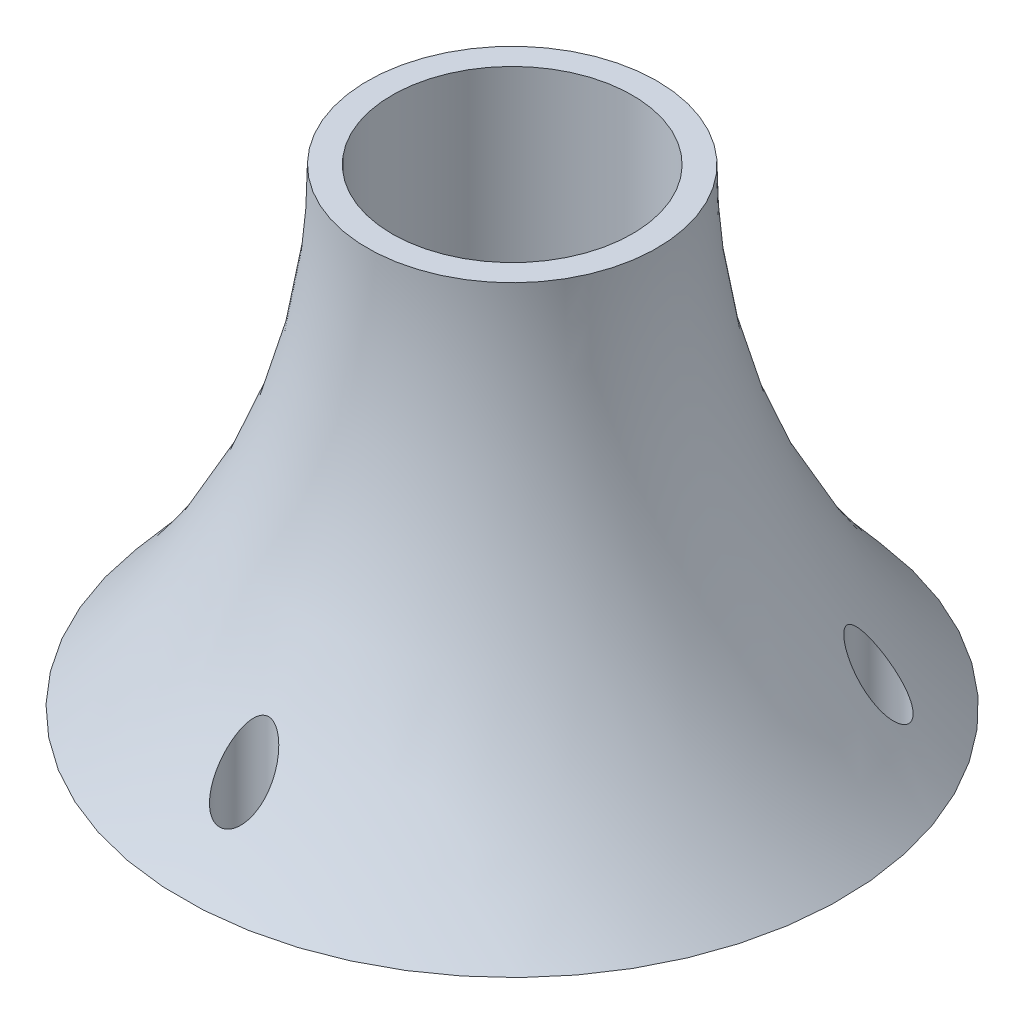
ISO-10303-21;
HEADER;
FILE_DESCRIPTION(('STEP AP214'),'2;1');
FILE_NAME('part.step','',(''),(''),'','','');
FILE_SCHEMA(('AUTOMOTIVE_DESIGN { 1 0 10303 214 1 1 1 1 }'));
ENDSEC;
DATA;
#1=APPLICATION_CONTEXT('core data for automotive mechanical design processes');
#2=APPLICATION_PROTOCOL_DEFINITION('international standard','automotive_design',2000,#1);
#3=PRODUCT_CONTEXT('',#1,'mechanical');
#4=PRODUCT('Part','Part','',(#3));
#5=PRODUCT_RELATED_PRODUCT_CATEGORY('part','',(#4));
#6=PRODUCT_DEFINITION_FORMATION('','',#4);
#7=PRODUCT_DEFINITION_CONTEXT('part definition',#1,'design');
#8=PRODUCT_DEFINITION('design','',#6,#7);
#9=PRODUCT_DEFINITION_SHAPE('','',#8);
#10=(LENGTH_UNIT() NAMED_UNIT(*) SI_UNIT(.MILLI.,.METRE.));
#11=(NAMED_UNIT(*) PLANE_ANGLE_UNIT() SI_UNIT($,.RADIAN.));
#12=(NAMED_UNIT(*) SI_UNIT($,.STERADIAN.) SOLID_ANGLE_UNIT());
#13=UNCERTAINTY_MEASURE_WITH_UNIT(LENGTH_MEASURE(1.E-05),#10,'distance_accuracy_value','');
#14=(GEOMETRIC_REPRESENTATION_CONTEXT(3) GLOBAL_UNCERTAINTY_ASSIGNED_CONTEXT((#13)) GLOBAL_UNIT_ASSIGNED_CONTEXT((#10,
#11,#12)) REPRESENTATION_CONTEXT('',''));
#15=CARTESIAN_POINT('',(0.,0.,0.));
#16=DIRECTION('',(0.,0.,1.));
#17=DIRECTION('',(1.,0.,0.));
#18=AXIS2_PLACEMENT_3D('',#15,#16,#17);
#19=CARTESIAN_POINT('',(0.,97.07,0.));
#20=DIRECTION('',(0.,1.,0.));
#21=DIRECTION('',(0.,0.,1.));
#22=AXIS2_PLACEMENT_3D('',#19,#20,#21);
#23=PLANE('',#22);
#24=CARTESIAN_POINT('',(0.,97.07,0.));
#25=DIRECTION('',(0.,-1.,0.));
#26=DIRECTION('',(0.,0.,-1.));
#27=AXIS2_PLACEMENT_3D('',#24,#25,#26);
#28=CIRCLE('',#27,29.845);
#29=CARTESIAN_POINT('',(0.,97.07,-29.845));
#30=VERTEX_POINT('',#29);
#31=EDGE_CURVE('E64',#30,#30,#28,.T.);
#32=ORIENTED_EDGE('',*,*,#31,.F.);
#33=EDGE_LOOP('',(#32));
#34=FACE_BOUND('',#33,.T.);
#35=CARTESIAN_POINT('',(0.,97.07,0.));
#36=DIRECTION('',(0.,1.,0.));
#37=DIRECTION('',(0.,0.,1.));
#38=AXIS2_PLACEMENT_3D('',#35,#36,#37);
#39=CIRCLE('',#38,24.765);
#40=CARTESIAN_POINT('',(0.,97.07,24.765));
#41=VERTEX_POINT('',#40);
#42=EDGE_CURVE('E10',#41,#41,#39,.T.);
#43=ORIENTED_EDGE('',*,*,#42,.F.);
#44=EDGE_LOOP('',(#43));
#45=FACE_BOUND('',#44,.T.);
#46=ADVANCED_FACE('F43',(#34,#45),#23,.T.);
#47=CARTESIAN_POINT('',(0.,0.,0.));
#48=DIRECTION('',(0.,1.,0.));
#49=DIRECTION('',(0.,0.,1.));
#50=AXIS2_PLACEMENT_3D('',#47,#48,#49);
#51=PLANE('',#50);
#52=CARTESIAN_POINT('',(-47.8435734320712,0.,-27.6225000000002));
#53=DIRECTION('',(0.,-1.,0.));
#54=DIRECTION('',(0.,0.,-1.));
#55=AXIS2_PLACEMENT_3D('',#52,#53,#54);
#56=CIRCLE('',#55,5.05);
#57=CARTESIAN_POINT('',(-47.8435734320712,0.,-32.6725000000002));
#58=VERTEX_POINT('',#57);
#59=EDGE_CURVE('E130',#58,#58,#56,.T.);
#60=ORIENTED_EDGE('',*,*,#59,.F.);
#61=EDGE_LOOP('',(#60));
#62=FACE_BOUND('',#61,.T.);
#63=CARTESIAN_POINT('',(47.8435734320716,0.,-27.6225));
#64=DIRECTION('',(0.,-1.,0.));
#65=DIRECTION('',(0.,0.,-1.));
#66=AXIS2_PLACEMENT_3D('',#63,#64,#65);
#67=CIRCLE('',#66,5.05);
#68=CARTESIAN_POINT('',(47.8435734320716,0.,-32.6725));
#69=VERTEX_POINT('',#68);
#70=EDGE_CURVE('E132',#69,#69,#67,.T.);
#71=ORIENTED_EDGE('',*,*,#70,.F.);
#72=EDGE_LOOP('',(#71));
#73=FACE_BOUND('',#72,.T.);
#74=CARTESIAN_POINT('',(0.,0.,55.245));
#75=DIRECTION('',(0.,-1.,0.));
#76=DIRECTION('',(0.,0.,-1.));
#77=AXIS2_PLACEMENT_3D('',#74,#75,#76);
#78=CIRCLE('',#77,5.05);
#79=CARTESIAN_POINT('',(0.,0.,50.195));
#80=VERTEX_POINT('',#79);
#81=EDGE_CURVE('E77',#80,#80,#78,.T.);
#82=ORIENTED_EDGE('',*,*,#81,.F.);
#83=EDGE_LOOP('',(#82));
#84=FACE_BOUND('',#83,.T.);
#85=CARTESIAN_POINT('',(0.,0.,0.));
#86=DIRECTION('',(0.,1.,0.));
#87=DIRECTION('',(0.,0.,1.));
#88=AXIS2_PLACEMENT_3D('',#85,#86,#87);
#89=CIRCLE('',#88,24.765);
#90=CARTESIAN_POINT('',(0.,0.,24.765));
#91=VERTEX_POINT('',#90);
#92=EDGE_CURVE('E60',#91,#91,#89,.T.);
#93=ORIENTED_EDGE('',*,*,#92,.T.);
#94=EDGE_LOOP('',(#93));
#95=FACE_BOUND('',#94,.T.);
#96=CARTESIAN_POINT('',(0.,0.,0.));
#97=DIRECTION('',(0.,-1.,0.));
#98=DIRECTION('',(0.,0.,-1.));
#99=AXIS2_PLACEMENT_3D('',#96,#97,#98);
#100=CIRCLE('',#99,67.945);
#101=CARTESIAN_POINT('',(0.,0.,-67.945));
#102=VERTEX_POINT('',#101);
#103=EDGE_CURVE('E118',#102,#102,#100,.T.);
#104=ORIENTED_EDGE('',*,*,#103,.T.);
#105=EDGE_LOOP('',(#104));
#106=FACE_BOUND('',#105,.T.);
#107=ADVANCED_FACE('F44',(#62,#73,#84,#95,#106),#51,.F.);
#108=CARTESIAN_POINT('',(0.,97.07,0.));
#109=DIRECTION('',(0.,-1.,0.));
#110=DIRECTION('',(0.,0.,-1.));
#111=AXIS2_PLACEMENT_3D('',#108,#109,#110);
#112=CYLINDRICAL_SURFACE('',#111,24.765);
#113=ORIENTED_EDGE('',*,*,#92,.F.);
#114=EDGE_LOOP('',(#113));
#115=FACE_BOUND('',#114,.T.);
#116=ORIENTED_EDGE('',*,*,#42,.T.);
#117=EDGE_LOOP('',(#116));
#118=FACE_BOUND('',#117,.T.);
#119=ADVANCED_FACE('F104',(#115,#118),#112,.F.);
#120=CARTESIAN_POINT('',(0.,97.07,0.));
#121=DIRECTION('',(0.,-1.,0.));
#122=DIRECTION('',(0.,0.,-1.));
#123=AXIS2_PLACEMENT_3D('',#120,#121,#122);
#124=TOROIDAL_SURFACE('',#123,172.550969816273,142.705969816273);
#125=CARTESIAN_POINT('',(-51.3571910642998,9.18542504719149,-31.2497566954239));
#126=CARTESIAN_POINT('',(-51.4889805939513,9.12629279793592,-31.1220855878612));
#127=CARTESIAN_POINT('',(-51.6163915120832,9.07750569736161,-30.9846758739162));
#128=CARTESIAN_POINT('',(-51.8577715013628,9.00385196658759,-30.6924605930095));
#129=CARTESIAN_POINT('',(-51.9717278741024,8.97900777784376,-30.5376388573802));
#130=CARTESIAN_POINT('',(-52.1821474068791,8.95510085105016,-30.2141306054535));
#131=CARTESIAN_POINT('',(-52.2785728679628,8.95609302703026,-30.0454153173187));
#132=CARTESIAN_POINT('',(-52.4505916390969,8.98392772963655,-29.6997976709833));
#133=CARTESIAN_POINT('',(-52.5261881469545,9.01076628529771,-29.5228965744017));
#134=CARTESIAN_POINT('',(-52.6532479192572,9.08694243283041,-29.1726810144053));
#135=CARTESIAN_POINT('',(-52.7054578396149,9.13546666011735,-28.9994552181204));
#136=CARTESIAN_POINT('',(-52.7901332466898,9.25189239951715,-28.6547815898227));
#137=CARTESIAN_POINT('',(-52.8225895021353,9.31980294949205,-28.4833346258229));
#138=CARTESIAN_POINT('',(-52.8798538927491,9.50614916560547,-28.0692248395133));
#139=CARTESIAN_POINT('',(-52.8946520887389,9.6335704273092,-27.8292236351956));
#140=CARTESIAN_POINT('',(-52.89236598386,9.91403714490475,-27.3647597340869));
#141=CARTESIAN_POINT('',(-52.8752081924902,10.067140927016,-27.1403340884313));
#142=CARTESIAN_POINT('',(-52.8230478405954,10.3491209532452,-26.76638161873));
#143=CARTESIAN_POINT('',(-52.7939439527388,10.4737397388432,-26.6127098448786));
#144=CARTESIAN_POINT('',(-52.7238197337986,10.7311798920443,-26.3151857335832));
#145=CARTESIAN_POINT('',(-52.6827938131023,10.8640050841455,-26.1713380412928));
#146=CARTESIAN_POINT('',(-52.5905582737983,11.1363537449466,-25.8933051450248));
#147=CARTESIAN_POINT('',(-52.5393362928549,11.2758851873965,-25.7591319426782));
#148=CARTESIAN_POINT('',(-52.4282233490621,11.5602398652776,-25.5004021278584));
#149=CARTESIAN_POINT('',(-52.3683326574624,11.7050629350244,-25.3758452146721));
#150=CARTESIAN_POINT('',(-52.2048841462658,12.0827408977526,-25.0677213845189));
#151=CARTESIAN_POINT('',(-52.0958756631025,12.3187800867426,-24.8909235716225));
#152=CARTESIAN_POINT('',(-51.863241685561,12.7986995078047,-24.5588625148154));
#153=CARTESIAN_POINT('',(-51.7396081427838,13.0425840030207,-24.4036112313807));
#154=CARTESIAN_POINT('',(-51.4802366030549,13.5365969863378,-24.1132045593151));
#155=CARTESIAN_POINT('',(-51.3444736468936,13.7867375496155,-23.9780922091115));
#156=CARTESIAN_POINT('',(-51.0631869510242,14.2911484127511,-23.7273656856467));
#157=CARTESIAN_POINT('',(-50.917664148072,14.5454183145021,-23.611749644851));
#158=CARTESIAN_POINT('',(-50.5610522273354,15.1549530487029,-23.3584271985312));
#159=CARTESIAN_POINT('',(-50.3462077864423,15.5115799541643,-23.2292342332674));
#160=CARTESIAN_POINT('',(-49.903764673542,16.2278333756835,-23.0051818458207));
#161=CARTESIAN_POINT('',(-49.67615938689,16.5874613636079,-22.9103404235291));
#162=CARTESIAN_POINT('',(-49.2103724417553,17.3068461815043,-22.7547881861978));
#163=CARTESIAN_POINT('',(-48.9722007276012,17.666602587011,-22.6940459851204));
#164=CARTESIAN_POINT('',(-48.607860103301,18.2043355301738,-22.6291505772046));
#165=CARTESIAN_POINT('',(-48.4852534998826,18.383233586753,-22.611889108989));
#166=CARTESIAN_POINT('',(-48.237713098497,18.7400501517795,-22.5863662701542));
#167=CARTESIAN_POINT('',(-48.1127795585337,18.9179687660236,-22.5781039077118));
#168=CARTESIAN_POINT('',(-47.8457004883016,19.2933455059943,-22.5705302974846));
#169=CARTESIAN_POINT('',(-47.7032675014544,19.490624673424,-22.5723938541501));
#170=CARTESIAN_POINT('',(-47.415565727374,19.8825513173929,-22.5886079499692));
#171=CARTESIAN_POINT('',(-47.2702974893187,20.077199291461,-22.6029560939145));
#172=CARTESIAN_POINT('',(-46.9769944186477,20.4626589169185,-22.6452035196624));
#173=CARTESIAN_POINT('',(-46.8289621843303,20.653473852619,-22.673090635542));
#174=CARTESIAN_POINT('',(-46.5299767824647,21.0299445764424,-22.7439162836606));
#175=CARTESIAN_POINT('',(-46.379024607341,21.2156020669655,-22.7868497840241));
#176=CARTESIAN_POINT('',(-46.1272467274621,21.5162452334686,-22.871952368916));
#177=CARTESIAN_POINT('',(-46.0272616621893,21.633336851442,-22.9091860699785));
#178=CARTESIAN_POINT('',(-45.8260861878564,21.8635540200579,-22.991725685609));
#179=CARTESIAN_POINT('',(-45.7248960928685,21.9766805750807,-23.0370295380013));
#180=CARTESIAN_POINT('',(-45.5214887079396,22.1977664911961,-23.1366071518463));
#181=CARTESIAN_POINT('',(-45.4192725831746,22.3057310537349,-23.190871627603));
#182=CARTESIAN_POINT('',(-45.2139924705968,22.515029028591,-23.3095141064333));
#183=CARTESIAN_POINT('',(-45.110928929641,22.6163657114392,-23.3738870673149));
#184=CARTESIAN_POINT('',(-44.8791435058713,22.8340688896325,-23.5311918886802));
#185=CARTESIAN_POINT('',(-44.7502859513275,22.9480848944491,-23.6272608794599));
#186=CARTESIAN_POINT('',(-44.4937313394135,23.1569239971862,-23.8398164163261));
#187=CARTESIAN_POINT('',(-44.3660328236439,23.2517758129311,-23.9562719166991));
#188=CARTESIAN_POINT('',(-44.1433829778103,23.3961956193831,-24.1829708382673));
#189=CARTESIAN_POINT('',(-44.0474849194469,23.4511456975404,-24.288797813388));
#190=CARTESIAN_POINT('',(-43.8614111314557,23.5402859830029,-24.5134687249089));
#191=CARTESIAN_POINT('',(-43.7712286609462,23.5745010687754,-24.6322968591308));
#192=CARTESIAN_POINT('',(-43.5993681756206,23.618759765635,-24.8816477245366));
#193=CARTESIAN_POINT('',(-43.5177576958334,23.6286234779872,-25.0122501488205));
#194=CARTESIAN_POINT('',(-43.3671330170521,23.6223856572957,-25.2799439143788));
#195=CARTESIAN_POINT('',(-43.2981200186529,23.6062816508517,-25.4170358725678));
#196=CARTESIAN_POINT('',(-43.1809484049022,23.5530965712203,-25.6780815014988));
#197=CARTESIAN_POINT('',(-43.1313607067592,23.5183965594448,-25.8019026605298));
#198=CARTESIAN_POINT('',(-43.0435685454763,23.4327171168868,-26.0478482878237));
#199=CARTESIAN_POINT('',(-43.0053687063103,23.3817310906217,-26.1699720477314));
#200=CARTESIAN_POINT('',(-42.9192961892907,23.231268802932,-26.4846919200454));
#201=CARTESIAN_POINT('',(-42.8798813149089,23.121239450053,-26.6745269822559));
#202=CARTESIAN_POINT('',(-42.8235202133011,22.8781053751534,-27.0424578759662));
#203=CARTESIAN_POINT('',(-42.8066455624142,22.7449286545555,-27.2205146123056));
#204=CARTESIAN_POINT('',(-42.7919488157082,22.4807392817009,-27.5432537966827));
#205=CARTESIAN_POINT('',(-42.7920222954795,22.3515088602384,-27.6893358591784));
#206=CARTESIAN_POINT('',(-42.8037528327141,22.0844803788837,-27.9730566904351));
#207=CARTESIAN_POINT('',(-42.8154188779009,21.9466757491099,-28.1106888200477));
#208=CARTESIAN_POINT('',(-42.8486347276977,21.6646477508644,-28.3783375229721));
#209=CARTESIAN_POINT('',(-42.8702004277398,21.520414397648,-28.5083414679898));
#210=CARTESIAN_POINT('',(-42.9219391848506,21.2272640066344,-28.7612156438113));
#211=CARTESIAN_POINT('',(-42.9521153185303,21.0783453116611,-28.8840833058152));
#212=CARTESIAN_POINT('',(-43.0175511797424,20.7883293764854,-29.1142171343939));
#213=CARTESIAN_POINT('',(-43.0522586894876,20.6474850204411,-29.2219619253091));
#214=CARTESIAN_POINT('',(-43.1276340050293,20.3634496910466,-29.4321608580421));
#215=CARTESIAN_POINT('',(-43.1683027601515,20.2202583471715,-29.5346141536708));
#216=CARTESIAN_POINT('',(-43.2985993830345,19.7878075391565,-29.8345911083435));
#217=CARTESIAN_POINT('',(-43.3964882541717,19.4957984802111,-30.0246322871578));
#218=CARTESIAN_POINT('',(-43.611858638314,18.9071827793383,-30.3864524007352));
#219=CARTESIAN_POINT('',(-43.7293703360095,18.6105697028961,-30.5582025223342));
#220=CARTESIAN_POINT('',(-43.9823232585734,18.0152881056454,-30.8837439158287));
#221=CARTESIAN_POINT('',(-44.1177592835521,17.7166202046783,-31.0375403718639));
#222=CARTESIAN_POINT('',(-44.4154622596525,17.0983763449959,-31.3370842356929));
#223=CARTESIAN_POINT('',(-44.5789295635586,16.7787646525674,-31.4815658622569));
#224=CARTESIAN_POINT('',(-44.9246389843112,16.140652802864,-31.7492565254035));
#225=CARTESIAN_POINT('',(-45.1068857295127,15.8221529397019,-31.8724602977581));
#226=CARTESIAN_POINT('',(-45.4893901488808,15.1887261114475,-32.095671752534));
#227=CARTESIAN_POINT('',(-45.689612641345,14.873793469445,-32.1957234308993));
#228=CARTESIAN_POINT('',(-46.1081055870343,14.248970908954,-32.370346512386));
#229=CARTESIAN_POINT('',(-46.3263671059593,13.9390785840617,-32.4449304362605));
#230=CARTESIAN_POINT('',(-46.6963369792063,13.440527640156,-32.5426765559738));
#231=CARTESIAN_POINT('',(-46.8426688174293,13.2495748450822,-32.5746493336586));
#232=CARTESIAN_POINT('',(-47.1422667464906,12.8714629737439,-32.6258755990967));
#233=CARTESIAN_POINT('',(-47.2955311332129,12.6843029813602,-32.6451321947026));
#234=CARTESIAN_POINT('',(-47.6087293517456,12.3148680800871,-32.6694799588987));
#235=CARTESIAN_POINT('',(-47.7686589509105,12.1325901881653,-32.6745799823725));
#236=CARTESIAN_POINT('',(-48.094926336478,11.774113425591,-32.6688787853252));
#237=CARTESIAN_POINT('',(-48.2612622944358,11.5979128472252,-32.658082069632));
#238=CARTESIAN_POINT('',(-48.5546259208816,11.2992389462781,-32.6237508488033));
#239=CARTESIAN_POINT('',(-48.6803109335192,11.1749653491059,-32.6043795552043));
#240=CARTESIAN_POINT('',(-48.9344727135323,10.93144284411,-32.5549644187549));
#241=CARTESIAN_POINT('',(-49.062949592756,10.8121941381588,-32.5249201475798));
#242=CARTESIAN_POINT('',(-49.3220923326888,10.579866808952,-32.4530836158934));
#243=CARTESIAN_POINT('',(-49.4527567428356,10.4667842933848,-32.4112988713258));
#244=CARTESIAN_POINT('',(-49.715536855848,10.2480802983032,-32.3148201245072));
#245=CARTESIAN_POINT('',(-49.8476525691767,10.1424588726205,-32.2601260291279));
#246=CARTESIAN_POINT('',(-50.1704611219257,9.89589047888767,-32.1093890671413));
#247=CARTESIAN_POINT('',(-50.3614688468114,9.75973004604672,-32.0057277467856));
#248=CARTESIAN_POINT('',(-50.6444085562274,9.57465017035324,-31.8261021819516));
#249=CARTESIAN_POINT('',(-50.7379972979203,9.51621914953609,-31.7623113673861));
#250=CARTESIAN_POINT('',(-50.9232745217958,9.40653729325769,-31.6263874880907));
#251=CARTESIAN_POINT('',(-51.0149643830808,9.35528107911748,-31.5542607473492));
#252=CARTESIAN_POINT('',(-51.1479033516346,9.28577242558287,-31.4417977887449));
#253=CARTESIAN_POINT('',(-51.1902889117438,9.26435364142035,-31.4047213557857));
#254=CARTESIAN_POINT('',(-51.2743231657403,9.2234266203648,-31.3286673423209));
#255=CARTESIAN_POINT('',(-51.3159712836978,9.20391982706715,-31.2896883581051));
#256=CARTESIAN_POINT('',(-51.3571910642998,9.18542504719149,-31.2497566954239));
#257=B_SPLINE_CURVE_WITH_KNOTS('',3,(#125,#126,#127,#128,#129,#130,#131,#132,#133,#134,#135,
#136,#137,#138,#139,#140,#141,#142,#143,#144,#145,#146,#147,#148,#149,#150,#151,#152,#153,#154,
#155,#156,#157,#158,#159,#160,#161,#162,#163,#164,#165,#166,#167,#168,#169,#170,#171,#172,#173,
#174,#175,#176,#177,#178,#179,#180,#181,#182,#183,#184,#185,#186,#187,#188,#189,#190,#191,#192,
#193,#194,#195,#196,#197,#198,#199,#200,#201,#202,#203,#204,#205,#206,#207,#208,#209,#210,#211,
#212,#213,#214,#215,#216,#217,#218,#219,#220,#221,#222,#223,#224,#225,#226,#227,#228,#229,#230,
#231,#232,#233,#234,#235,#236,#237,#238,#239,#240,#241,#242,#243,#244,#245,#246,#247,#248,#249,
#250,#251,#252,#253,#254,#255,#256),.UNSPECIFIED.,.T.,.F.,(4,2,2,2,2,2,2,2,2,2,2,2,2,2,2,2,2,2,
2,2,2,2,2,2,2,2,2,2,2,2,2,2,2,2,2,2,2,2,2,2,2,2,2,2,2,2,2,2,2,2,2,2,2,2,2,2,2,2,2,2,2,2,2,2,2,
4),(0.,0.578134970386196,1.15681129549281,1.73671767126707,2.31653496606911,2.8762246993172,
3.43617578603305,4.24804246784648,5.06177853874275,5.6609356191236,6.26037406715301,
6.86054378772689,7.46069473265269,8.40247024971834,9.34476647298877,10.2890484389443,
11.2332399015067,12.5392618503122,13.8459671558943,15.1514677468836,15.8040030914437,
16.45646651051,17.1861317111098,17.9156569539377,18.6445278659325,19.3731552580656,
19.8481707367086,20.3230650077266,20.7974702096037,21.2716395217442,21.8612935105248,
22.4500572311845,22.9073912166353,23.3641753869895,23.8243241409045,24.2845167261328,
24.696371657923,25.1083935939457,25.7733498547752,26.440412699628,27.0246981785132,
27.6094370080289,28.1951180283501,28.7810085821347,29.3228837563739,29.8648453179275,
30.9492592232241,32.035356852649,33.1211400904331,34.2810295364764,35.4412055341038,
36.5991584035652,37.7565411643843,38.4842195997804,39.2117201236751,39.9387654960258,
40.6656048774515,41.1986714634935,41.7317594448242,42.2645069317043,42.7972582619496,
43.5633200781927,43.9452776494278,44.3269473303114,44.507635081792,44.6884582223004),.UNSPECIFIED.);
#258=CARTESIAN_POINT('',(-51.3571910642998,9.18542504719149,-31.2497566954239));
#259=VERTEX_POINT('',#258);
#260=EDGE_CURVE('E50',#259,#259,#257,.T.);
#261=ORIENTED_EDGE('',*,*,#260,.F.);
#262=EDGE_LOOP('',(#261));
#263=FACE_BOUND('',#262,.T.);
#264=CARTESIAN_POINT('',(51.3571910643002,9.18542504719119,-31.2497566954237));
#265=CARTESIAN_POINT('',(51.2631658752089,9.22761670798013,-31.3408371457834));
#266=CARTESIAN_POINT('',(51.1668391820427,9.27509824652639,-31.4270464864924));
#267=CARTESIAN_POINT('',(50.9709711615564,9.37941099379876,-31.5896290540654));
#268=CARTESIAN_POINT('',(50.8714278224048,9.43624814860042,-31.6659959700626));
#269=CARTESIAN_POINT('',(50.5692932570567,9.61931163419143,-31.8809125297006));
#270=CARTESIAN_POINT('',(50.3636193567052,9.75789524382806,-32.0048805516714));
#271=CARTESIAN_POINT('',(50.0256042962449,10.0050970285909,-32.1792003079983));
#272=CARTESIAN_POINT('',(49.8932422433492,10.106801254901,-32.2400443614494));
#273=CARTESIAN_POINT('',(49.6294831974294,10.3183912210094,-32.3483135449923));
#274=CARTESIAN_POINT('',(49.4980864025744,10.4282785919447,-32.3957359906781));
#275=CARTESIAN_POINT('',(49.2371702698158,10.6547723186272,-32.4783359598528));
#276=CARTESIAN_POINT('',(49.1076522389079,10.7713830951213,-32.5135053172181));
#277=CARTESIAN_POINT('',(48.8512086629893,11.0100637490964,-32.5726996564461));
#278=CARTESIAN_POINT('',(48.7242827658047,11.1321328777068,-32.5967261619641));
#279=CARTESIAN_POINT('',(48.4050841959473,11.4485496181293,-32.6450131911603));
#280=CARTESIAN_POINT('',(48.2148681754625,11.6460559938343,-32.662275280683));
#281=CARTESIAN_POINT('',(47.8425191452201,12.0492521306178,-32.6759363989034));
#282=CARTESIAN_POINT('',(47.6603904558933,12.2549461570498,-32.6723244081719));
#283=CARTESIAN_POINT('',(47.3045072512051,12.6728586138744,-32.6468185435996));
#284=CARTESIAN_POINT('',(47.1307663182504,12.8850867713817,-32.6248960046486));
#285=CARTESIAN_POINT('',(46.7922655104061,13.3142566783374,-32.5648462315021));
#286=CARTESIAN_POINT('',(46.6275050442885,13.5311981161692,-32.5267200655279));
#287=CARTESIAN_POINT('',(46.2283162948817,14.0762184096151,-32.4136565144073));
#288=CARTESIAN_POINT('',(45.9994278080659,14.4065364330142,-32.3298364957764));
#289=CARTESIAN_POINT('',(45.562042102593,15.0724018401026,-32.1340999763048));
#290=CARTESIAN_POINT('',(45.3535558211759,15.4079519180684,-32.0221685188712));
#291=CARTESIAN_POINT('',(44.9569347159756,16.0825446989236,-31.772776916241));
#292=CARTESIAN_POINT('',(44.7688416552541,16.4215930677822,-31.6352658936407));
#293=CARTESIAN_POINT('',(44.414062935633,17.1003166534464,-31.3366243249469));
#294=CARTESIAN_POINT('',(44.2473700282683,17.4399916182644,-31.1755018161297));
#295=CARTESIAN_POINT('',(43.9602500685729,18.0657242390907,-30.8568366062248));
#296=CARTESIAN_POINT('',(43.8366504470422,18.3519924830116,-30.7025554368687));
#297=CARTESIAN_POINT('',(43.6064273749415,18.9220040451873,-30.3772818051965));
#298=CARTESIAN_POINT('',(43.4998087328533,19.2057466268556,-30.206284631474));
#299=CARTESIAN_POINT('',(43.3056253090142,19.7673530606597,-29.8475798668969));
#300=CARTESIAN_POINT('',(43.2179767319134,20.0452376602135,-29.6599511494736));
#301=CARTESIAN_POINT('',(43.1023347445437,20.4561867023712,-29.364424078828));
#302=CARTESIAN_POINT('',(43.0664343368759,20.5921499590087,-29.2636002472437));
#303=CARTESIAN_POINT('',(43.0003668189321,20.861612191209,-29.0569401041051));
#304=CARTESIAN_POINT('',(42.970199106468,20.9951114242723,-28.9511043204895));
#305=CARTESIAN_POINT('',(42.9016761815175,21.3297080108252,-28.6759276348296));
#306=CARTESIAN_POINT('',(42.8675804111915,21.5287439189768,-28.5029146686639));
#307=CARTESIAN_POINT('',(42.829739117898,21.8192832253961,-28.2326065280391));
#308=CARTESIAN_POINT('',(42.8193386069906,21.914887570255,-28.1406060610995));
#309=CARTESIAN_POINT('',(42.8035054933895,22.1027068067267,-27.952810037276));
#310=CARTESIAN_POINT('',(42.7980718876689,22.1949223790633,-27.8570152507032));
#311=CARTESIAN_POINT('',(42.7927468652048,22.3761560344034,-27.6603074412824));
#312=CARTESIAN_POINT('',(42.7929161673304,22.4651286179656,-27.559350191532));
#313=CARTESIAN_POINT('',(42.7997053991148,22.6376476177825,-27.3531456379772));
#314=CARTESIAN_POINT('',(42.8063269244331,22.7211926863404,-27.2478972791341));
#315=CARTESIAN_POINT('',(42.837203726932,22.9611790810205,-26.9259944420199));
#316=CARTESIAN_POINT('',(42.8724322906555,23.107789692583,-26.7023229076616));
#317=CARTESIAN_POINT('',(42.9577197664403,23.3038484443446,-26.3381579141435));
#318=CARTESIAN_POINT('',(42.9951266753524,23.3681176991173,-26.2026808896356));
#319=CARTESIAN_POINT('',(43.0839668891359,23.4776507507473,-25.9285895278526));
#320=CARTESIAN_POINT('',(43.1353850400303,23.5229349474975,-25.789978727618));
#321=CARTESIAN_POINT('',(43.2533335414436,23.5905557995165,-25.5117697724018));
#322=CARTESIAN_POINT('',(43.320001730066,23.6126721968049,-25.3721746213979));
#323=CARTESIAN_POINT('',(43.4668204047605,23.6304376005163,-25.0984961317095));
#324=CARTESIAN_POINT('',(43.5469641836128,23.6260997363488,-24.9644100920816));
#325=CARTESIAN_POINT('',(43.7081253130554,23.5934972218284,-24.7208526052595));
#326=CARTESIAN_POINT('',(43.7880786871685,23.5679145094056,-24.6102955051979));
#327=CARTESIAN_POINT('',(43.9534968727261,23.4987025654764,-24.3994902491616));
#328=CARTESIAN_POINT('',(44.0389651112276,23.4550620194782,-24.2992486057991));
#329=CARTESIAN_POINT('',(44.2537038462402,23.3290574304797,-24.0656860083596));
#330=CARTESIAN_POINT('',(44.384821974522,23.2381252775358,-23.938725372249));
#331=CARTESIAN_POINT('',(44.6492053315199,23.0336451831762,-23.7071956629774));
#332=CARTESIAN_POINT('',(44.7824754312897,22.9200363840645,-23.6026884503506));
#333=CARTESIAN_POINT('',(45.0280720781261,22.6959927672558,-23.4279201906942));
#334=CARTESIAN_POINT('',(45.1404685450308,22.5877551926905,-23.3548642723495));
#335=CARTESIAN_POINT('',(45.3643524726256,22.3629716164318,-23.221023959213));
#336=CARTESIAN_POINT('',(45.4758392168374,22.2464196604158,-23.1602484808561));
#337=CARTESIAN_POINT('',(45.6976686400853,22.006967537451,-23.0494284517595));
#338=CARTESIAN_POINT('',(45.8080091940831,21.8840574754172,-22.9994012925095));
#339=CARTESIAN_POINT('',(46.0272756180036,21.6334894778974,-22.9089419858974));
#340=CARTESIAN_POINT('',(46.1362009517094,21.5058298097517,-22.868513380591));
#341=CARTESIAN_POINT('',(46.3460411391408,21.2546785527158,-22.7984579644679));
#342=CARTESIAN_POINT('',(46.4470434266659,21.1313987930625,-22.7683273454942));
#343=CARTESIAN_POINT('',(46.6477403959751,20.8822828496435,-22.7150306891961));
#344=CARTESIAN_POINT('',(46.7474348520009,20.7564462338246,-22.6918658395612));
#345=CARTESIAN_POINT('',(47.0446873805555,20.3757627030314,-22.6319858435736));
#346=CARTESIAN_POINT('',(47.2403195475238,20.1178569682861,-22.6049159361474));
#347=CARTESIAN_POINT('',(47.6268782809228,19.5964360361698,-22.5734220764036));
#348=CARTESIAN_POINT('',(47.8177933818364,19.3329096129012,-22.569048755789));
#349=CARTESIAN_POINT('',(48.1944548815623,18.8027972466351,-22.581184823363));
#350=CARTESIAN_POINT('',(48.3802024293926,18.5362120026979,-22.5976895307244));
#351=CARTESIAN_POINT('',(48.8086156018807,17.9105630100876,-22.6593700149535));
#352=CARTESIAN_POINT('',(49.049197555968,17.5508269948531,-22.7123767907822));
#353=CARTESIAN_POINT('',(49.5200318105714,16.831035849989,-22.8525612030639));
#354=CARTESIAN_POINT('',(49.7502790878298,16.4709806500917,-22.9397552603127));
#355=CARTESIAN_POINT('',(50.1981792332605,15.7538402776288,-23.1482132962777));
#356=CARTESIAN_POINT('',(50.4158543368655,15.3967508815071,-23.2694147557656));
#357=CARTESIAN_POINT('',(50.8362771891286,14.6876513966739,-23.5470061395489));
#358=CARTESIAN_POINT('',(51.0390348793349,14.3356380532008,-23.7033723415337));
#359=CARTESIAN_POINT('',(51.347211313456,13.7809790512459,-23.9823085455185));
#360=CARTESIAN_POINT('',(51.4587607040033,13.5756480582065,-24.0928704661325));
#361=CARTESIAN_POINT('',(51.674002747791,13.1687639115177,-24.3277032850602));
#362=CARTESIAN_POINT('',(51.7776973843344,12.9672098139517,-24.4519707031809));
#363=CARTESIAN_POINT('',(51.9757086238905,12.5691072777811,-24.7147512974383));
#364=CARTESIAN_POINT('',(52.0700336099762,12.3725544837882,-24.8532515094882));
#365=CARTESIAN_POINT('',(52.2475569021498,11.9856824771668,-25.145278969115));
#366=CARTESIAN_POINT('',(52.3307587025216,11.7953613211593,-25.298801471155));
#367=CARTESIAN_POINT('',(52.4614888304914,11.4768725583947,-25.5747184292224));
#368=CARTESIAN_POINT('',(52.5123625320368,11.3466966282863,-25.6932165359095));
#369=CARTESIAN_POINT('',(52.6062961318684,11.0912233364965,-25.9383937572409));
#370=CARTESIAN_POINT('',(52.6493544778518,10.9659269478735,-26.0650744903761));
#371=CARTESIAN_POINT('',(52.7263612360813,10.7214692043096,-26.3265706973371));
#372=CARTESIAN_POINT('',(52.7603217619488,10.6022998639636,-26.461375058569));
#373=CARTESIAN_POINT('',(52.8177528908474,10.3712878791731,-26.7392307819654));
#374=CARTESIAN_POINT('',(52.8412249174128,10.2594442422193,-26.8822810219944));
#375=CARTESIAN_POINT('',(52.8829479910405,10.0019186103665,-27.2350725676556));
#376=CARTESIAN_POINT('',(52.8954072335738,9.86047571470349,-27.4487054892505));
#377=CARTESIAN_POINT('',(52.8913091918847,9.60112515841636,-27.8895414050597));
#378=CARTESIAN_POINT('',(52.8747935057987,9.48318402790265,-28.1167244936047));
#379=CARTESIAN_POINT('',(52.8140635227268,9.29820763730888,-28.5346710655976));
#380=CARTESIAN_POINT('',(52.7759134313999,9.22572554221679,-28.7238440763192));
#381=CARTESIAN_POINT('',(52.7006554025968,9.13509315573094,-29.0084759971116));
#382=CARTESIAN_POINT('',(52.6725544961827,9.10789288472433,-29.103522918332));
#383=CARTESIAN_POINT('',(52.6102401795102,9.05997634662196,-29.2932294658914));
#384=CARTESIAN_POINT('',(52.5760294033649,9.03925729586468,-29.3878892412199));
#385=CARTESIAN_POINT('',(52.5012508956084,9.0045790973894,-29.5767067831035));
#386=CARTESIAN_POINT('',(52.4606411944004,8.99066726273498,-29.6708566601472));
#387=CARTESIAN_POINT('',(52.3734294973621,8.9701107901462,-29.8571077916003));
#388=CARTESIAN_POINT('',(52.3268301885979,8.96346290607772,-29.9492099430612));
#389=CARTESIAN_POINT('',(52.2279637099011,8.95757265766183,-30.1305430057898));
#390=CARTESIAN_POINT('',(52.1756978729748,8.95832855535481,-30.2197745859599));
#391=CARTESIAN_POINT('',(52.0659875670589,8.96721755054227,-30.3945707884657));
#392=CARTESIAN_POINT('',(52.0085439824399,8.97534939035232,-30.4801360333497));
#393=CARTESIAN_POINT('',(51.8590804253072,9.0047138405077,-30.68874743523));
#394=CARTESIAN_POINT('',(51.7641486391926,9.0304672313879,-30.8091101935478));
#395=CARTESIAN_POINT('',(51.5661814554529,9.09705147030402,-31.0382946784699));
#396=CARTESIAN_POINT('',(51.4631475913963,9.13787947038546,-31.147118580045));
#397=CARTESIAN_POINT('',(51.3571910643002,9.18542504719119,-31.2497566954237));
#398=B_SPLINE_CURVE_WITH_KNOTS('',3,(#264,#265,#266,#267,#268,#269,#270,#271,#272,#273,#274,
#275,#276,#277,#278,#279,#280,#281,#282,#283,#284,#285,#286,#287,#288,#289,#290,#291,#292,#293,
#294,#295,#296,#297,#298,#299,#300,#301,#302,#303,#304,#305,#306,#307,#308,#309,#310,#311,#312,
#313,#314,#315,#316,#317,#318,#319,#320,#321,#322,#323,#324,#325,#326,#327,#328,#329,#330,#331,
#332,#333,#334,#335,#336,#337,#338,#339,#340,#341,#342,#343,#344,#345,#346,#347,#348,#349,#350,
#351,#352,#353,#354,#355,#356,#357,#358,#359,#360,#361,#362,#363,#364,#365,#366,#367,#368,#369,
#370,#371,#372,#373,#374,#375,#376,#377,#378,#379,#380,#381,#382,#383,#384,#385,#386,#387,#388,
#389,#390,#391,#392,#393,#394,#395,#396,#397),.UNSPECIFIED.,.T.,.F.,(4,2,2,2,2,2,2,2,2,2,2,2,2,
2,2,2,2,2,2,2,2,2,2,2,2,2,2,2,2,2,2,2,2,2,2,2,2,2,2,2,2,2,2,2,2,2,2,2,2,2,2,2,2,2,2,2,2,2,2,2,2,
2,2,2,2,2,4),(0.,0.412374131408385,0.825011371409781,1.65209028222927,2.1845111958975,
2.71703852197027,3.24992007731898,3.78272874581497,4.60570253671612,5.42911081523799,
6.25381055838922,7.07845594178765,8.30823550838768,9.5386707661781,10.7715800307292,
12.0040705874756,13.0469814903479,14.0901871898801,15.1286862399587,15.6476228885442,
16.1665049955113,16.9630967148121,17.362209840147,17.7612423499581,18.1646005880013,
18.5680586034039,19.3714430869615,19.8336414000417,20.2953417892696,20.7613928274429,
21.227212580506,21.6418389044388,22.0567254150059,22.6649985475569,23.2749266093396,
23.7910851976918,24.3076172162002,24.8249788260527,25.3425310568362,25.8289218451761,
26.315395517974,27.2887979686579,28.2643709617328,29.2397252713457,30.5461848679275,
31.8532727519461,33.1579732540657,34.4617962250049,35.2369034675002,36.011814340688,
36.7860255315642,37.5599929341308,38.1093463044738,38.6588086694543,39.2075357551414,
39.7561883431151,40.5231080590568,41.2889276401129,41.9046284014867,42.2126350355258,
42.520509199577,42.8304938549572,43.1403399268195,43.4501132673311,43.7598337977916,
44.2246239607272,44.6893263585697),.UNSPECIFIED.);
#399=CARTESIAN_POINT('',(51.3571910643002,9.18542504719119,-31.2497566954237));
#400=VERTEX_POINT('',#399);
#401=EDGE_CURVE('E73',#400,#400,#398,.T.);
#402=ORIENTED_EDGE('',*,*,#401,.F.);
#403=EDGE_LOOP('',(#402));
#404=FACE_BOUND('',#403,.T.);
#405=CARTESIAN_POINT('',(-2.23326848097639,9.57238427129096,59.7743500518151));
#406=CARTESIAN_POINT('',(-2.07030092846753,9.47676650281626,59.8547028908452));
#407=CARTESIAN_POINT('',(-1.89886720076207,9.38962335521069,59.9282969363957));
#408=CARTESIAN_POINT('',(-1.54035068834348,9.23639459322939,60.0581118734264));
#409=CARTESIAN_POINT('',(-1.35326611662445,9.17031138762215,60.1143307775715));
#410=CARTESIAN_POINT('',(-1.06301131798476,9.08990825041809,60.1828690309237));
#411=CARTESIAN_POINT('',(-0.964220874618586,9.06616794002286,60.2031346675775));
#412=CARTESIAN_POINT('',(-0.764258389679296,9.02551762998858,60.2378632447805));
#413=CARTESIAN_POINT('',(-0.663087416250595,9.00860462653225,60.2523287372064));
#414=CARTESIAN_POINT('',(-0.459164095207316,8.98195928981404,60.2751286870166));
#415=CARTESIAN_POINT('',(-0.356412424237556,8.97222396679175,60.2834656971284));
#416=CARTESIAN_POINT('',(-0.150159523703398,8.96013132073005,60.2938225837817));
#417=CARTESIAN_POINT('',(-0.0466583509293569,8.95777344443894,60.2958429340241));
#418=CARTESIAN_POINT('',(0.152101015148446,8.96038026983793,60.2936098363092));
#419=CARTESIAN_POINT('',(0.24737269363501,8.96478836169366,60.2898332763668));
#420=CARTESIAN_POINT('',(0.437089465562303,8.97983653413502,60.2769475366724));
#421=CARTESIAN_POINT('',(0.531534270881921,8.99047870560245,60.2678365677844));
#422=CARTESIAN_POINT('',(0.718878145208872,9.01780316679275,60.2444620106948));
#423=CARTESIAN_POINT('',(0.811777530519703,9.03448420421874,60.2301994907864));
#424=CARTESIAN_POINT('',(0.995476878935392,9.07359628532477,60.1967935912811));
#425=CARTESIAN_POINT('',(1.08627598995412,9.09602961961719,60.1776482673274));
#426=CARTESIAN_POINT('',(1.35427646888481,9.17132424558929,60.1134735937265));
#427=CARTESIAN_POINT('',(1.52767340228656,9.23226967527485,60.0616286205374));
#428=CARTESIAN_POINT('',(1.86118583719154,9.37240266477932,59.9428673284688));
#429=CARTESIAN_POINT('',(2.02129576123006,9.45159783310304,59.8759447238292));
#430=CARTESIAN_POINT('',(2.41017558099865,9.67213457058617,59.6904224591331));
#431=CARTESIAN_POINT('',(2.62913744710168,9.82389769041368,59.563470741864));
#432=CARTESIAN_POINT('',(2.93165439509594,10.0707061261324,59.358739576552));
#433=CARTESIAN_POINT('',(3.02831146727319,10.1563280244153,59.287982256345));
#434=CARTESIAN_POINT('',(3.21331606440882,10.3330615115454,59.1425520939745));
#435=CARTESIAN_POINT('',(3.30166531722443,10.4241719523917,59.0678800710436));
#436=CARTESIAN_POINT('',(3.51290994451263,10.658151468385,58.8769755429514));
#437=CARTESIAN_POINT('',(3.6307666647071,10.8039576674727,58.7587692522759));
#438=CARTESIAN_POINT('',(3.84973202904195,11.1038322202895,58.5174034021963));
#439=CARTESIAN_POINT('',(3.95083220776435,11.2579046984373,58.3942413779616));
#440=CARTESIAN_POINT('',(4.13765236042537,11.5727620972021,58.1444293378656));
#441=CARTESIAN_POINT('',(4.22335193181186,11.7335555793668,58.0177749477124));
#442=CARTESIAN_POINT('',(4.3803906729928,12.0603182324454,57.7623680741235));
#443=CARTESIAN_POINT('',(4.45173053394835,12.2262871538111,57.633615691991));
#444=CARTESIAN_POINT('',(4.61766368645941,12.6572579856761,57.301919484781));
#445=CARTESIAN_POINT('',(4.70266750924348,12.9253027588768,57.0981015577358));
#446=CARTESIAN_POINT('',(4.8436249472697,13.4687182718893,56.6901252890165));
#447=CARTESIAN_POINT('',(4.89956207887913,13.7440930756976,56.4859668199094));
#448=CARTESIAN_POINT('',(4.98502898628668,14.3003745249555,56.0788487243076));
#449=CARTESIAN_POINT('',(5.01451860298592,14.5812889232633,55.8758913842607));
#450=CARTESIAN_POINT('',(5.04890992587827,15.1465112411053,55.4728322308179));
#451=CARTESIAN_POINT('',(5.05381621638295,15.4308185180209,55.2727298919603));
#452=CARTESIAN_POINT('',(5.04009648708538,16.0155966005975,54.8665242314566));
#453=CARTESIAN_POINT('',(5.02029632677346,16.3161722356576,54.6606125945758));
#454=CARTESIAN_POINT('',(4.95606067290001,16.9181829807695,54.2538554259775));
#455=CARTESIAN_POINT('',(4.91162078547084,17.2196182345717,54.0530108045136));
#456=CARTESIAN_POINT('',(4.79841914638018,17.8213177952745,53.6575783567067));
#457=CARTESIAN_POINT('',(4.72969635805146,18.121583203462,53.462981048667));
#458=CARTESIAN_POINT('',(4.56739503801342,18.7196638648239,53.0806165931842));
#459=CARTESIAN_POINT('',(4.47382532130706,19.0174799483952,52.8928470502463));
#460=CARTESIAN_POINT('',(4.30140811101841,19.4947204035412,52.5959520711492));
#461=CARTESIAN_POINT('',(4.23075139363912,19.675602184555,52.484368674674));
#462=CARTESIAN_POINT('',(4.07885857052256,20.0349083222657,52.2645179975286));
#463=CARTESIAN_POINT('',(3.99762426432697,20.2133330912721,52.1562501566515));
#464=CARTESIAN_POINT('',(3.82372377338983,20.5669202135526,51.9434044005243));
#465=CARTESIAN_POINT('',(3.7310528728877,20.7420811865397,51.8388280304246));
#466=CARTESIAN_POINT('',(3.53320991892613,21.0878211360882,51.6340154161046));
#467=CARTESIAN_POINT('',(3.42804089998687,21.2584012126016,51.5337781263944));
#468=CARTESIAN_POINT('',(3.23328961822983,21.5490943715201,51.3642377809327));
#469=CARTESIAN_POINT('',(3.14690726261314,21.6706569017443,51.2937459460135));
#470=CARTESIAN_POINT('',(2.96577837009087,21.909409610819,51.1560379897665));
#471=CARTESIAN_POINT('',(2.87103035278871,22.0265990105547,51.0888224514952));
#472=CARTESIAN_POINT('',(2.67249941827744,22.2550274690332,50.9584719559148));
#473=CARTESIAN_POINT('',(2.56873544526117,22.366278247689,50.8953289060083));
#474=CARTESIAN_POINT('',(2.35107345057806,22.5811907406656,50.7739296032494));
#475=CARTESIAN_POINT('',(2.23718229431045,22.6848575107251,50.7156700910294));
#476=CARTESIAN_POINT('',(1.98244233714984,22.895149866787,50.5979977397302));
#477=CARTESIAN_POINT('',(1.84001754536874,23.0003759439254,50.5394383218886));
#478=CARTESIAN_POINT('',(1.53972700203744,23.1927324977403,50.4328241855178));
#479=CARTESIAN_POINT('',(1.38188026522395,23.2798848546366,50.38475676153));
#480=CARTESIAN_POINT('',(1.08170129545162,23.4153604817796,50.3102564147677));
#481=CARTESIAN_POINT('',(0.941883423161057,23.4678815985137,50.2814678216998));
#482=CARTESIAN_POINT('',(0.654243722101411,23.5519612275828,50.2354494900986));
#483=CARTESIAN_POINT('',(0.506431530549509,23.5835443973249,50.2182061551445));
#484=CARTESIAN_POINT('',(0.205589790919327,23.6225407775049,50.1969228234542));
#485=CARTESIAN_POINT('',(0.0525318330076894,23.6297899555893,50.192972432335));
#486=CARTESIAN_POINT('',(-0.252387108593274,23.6187293808563,50.1990050943115));
#487=CARTESIAN_POINT('',(-0.404247834128714,23.6004142595444,50.2089910740406));
#488=CARTESIAN_POINT('',(-0.687011598040013,23.5434261006774,50.240124781418));
#489=CARTESIAN_POINT('',(-0.818506220048183,23.5069342958797,50.2600771326038));
#490=CARTESIAN_POINT('',(-1.07414958604465,23.4179650829442,50.3088415746843));
#491=CARTESIAN_POINT('',(-1.19829561409807,23.3654818081015,50.3376569171339));
#492=CARTESIAN_POINT('',(-1.51543677846247,23.209766529488,50.4234133498771));
#493=CARTESIAN_POINT('',(-1.70136763306163,23.0956033953082,50.4865250109381));
#494=CARTESIAN_POINT('',(-2.05117045571298,22.8441040382569,50.6264573850862));
#495=CARTESIAN_POINT('',(-2.21496845463663,22.7066934061783,50.7033221653314));
#496=CARTESIAN_POINT('',(-2.50440001877845,22.4337933873916,50.8570638029838));
#497=CARTESIAN_POINT('',(-2.63225590938381,22.3000089689995,50.9328580418585));
#498=CARTESIAN_POINT('',(-2.87442585187165,22.0238288843452,51.0903564973714));
#499=CARTESIAN_POINT('',(-2.9887291979426,21.8814265427243,51.172065305237));
#500=CARTESIAN_POINT('',(-3.2054263230671,21.5902049817545,51.3403136590651));
#501=CARTESIAN_POINT('',(-3.30780137049037,21.4413761597371,51.4268604953165));
#502=CARTESIAN_POINT('',(-3.50174620393338,21.1390552161261,51.6039128799332));
#503=CARTESIAN_POINT('',(-3.59331214064385,20.9855614575912,51.6944198229276));
#504=CARTESIAN_POINT('',(-3.75963220386604,20.6875815461676,51.8713969245753));
#505=CARTESIAN_POINT('',(-3.83514598610192,20.5433625147047,51.9576071766543));
#506=CARTESIAN_POINT('',(-3.97844995248494,20.2526351011891,52.1325710675188));
#507=CARTESIAN_POINT('',(-4.04623892778697,20.1061263648915,52.2213251016652));
#508=CARTESIAN_POINT('',(-4.23881788905966,19.6638031857686,52.4911200314848));
#509=CARTESIAN_POINT('',(-4.35275005115807,19.3653195581881,52.6756179761574));
#510=CARTESIAN_POINT('',(-4.55430104637823,18.7638965813395,53.0526133703268));
#511=CARTESIAN_POINT('',(-4.64187300474588,18.4609502877884,53.2451243853205));
#512=CARTESIAN_POINT('',(-4.79167096409019,17.8532413147335,53.6367946565301));
#513=CARTESIAN_POINT('',(-4.85390432869187,17.5484791890868,53.8359519630439));
#514=CARTESIAN_POINT('',(-4.95656412564076,16.9192120612876,54.2530302177462));
#515=CARTESIAN_POINT('',(-4.99533944058855,16.5946921869911,54.471336162723));
#516=CARTESIAN_POINT('',(-5.04401832150635,15.9471396225473,54.9135413436791));
#517=CARTESIAN_POINT('',(-5.05391386061656,15.6241073707741,55.1374421172513));
#518=CARTESIAN_POINT('',(-5.04332094765622,14.9824213908765,55.5888830589889));
#519=CARTESIAN_POINT('',(-5.022918141712,14.6637578806601,55.8164111767295));
#520=CARTESIAN_POINT('',(-4.94947480829267,14.0321714557928,56.2740196567894));
#521=CARTESIAN_POINT('',(-4.89645404445328,13.7192451830241,56.5040983908241));
#522=CARTESIAN_POINT('',(-4.78564498673695,13.2378869397257,56.8630988725653));
#523=CARTESIAN_POINT('',(-4.74023587883059,13.0665024035332,56.9919536308961));
#524=CARTESIAN_POINT('',(-4.63734321143069,12.7270486614032,57.2491809178318));
#525=CARTESIAN_POINT('',(-4.57986237900704,12.5589787160458,57.3775535486964));
#526=CARTESIAN_POINT('',(-4.45188163891125,12.2267800823938,57.6332428419481));
#527=CARTESIAN_POINT('',(-4.3813712904276,12.062654674977,57.760558571316));
#528=CARTESIAN_POINT('',(-4.2263462817495,11.7394975790674,58.0131142228295));
#529=CARTESIAN_POINT('',(-4.14183381586222,11.580465097102,58.138354466852));
#530=CARTESIAN_POINT('',(-3.97231749834377,11.2935992382228,58.3658919218146));
#531=CARTESIAN_POINT('',(-3.88954158376345,11.1648351048408,58.4686626866971));
#532=CARTESIAN_POINT('',(-3.71257548472926,10.9127991648368,58.6709851300316));
#533=CARTESIAN_POINT('',(-3.61838337757589,10.7895282881762,58.7705362626509));
#534=CARTESIAN_POINT('',(-3.31809651191557,10.430484649548,59.0621087220635));
#535=CARTESIAN_POINT('',(-3.09355587849944,10.2041881958696,59.2480773314331));
#536=CARTESIAN_POINT('',(-2.7486427213642,9.92091932811081,59.4829682144339));
#537=CARTESIAN_POINT('',(-2.6509330665782,9.84655295860225,59.5448697745671));
#538=CARTESIAN_POINT('',(-2.44784206245173,9.70431474588362,59.6636445595405));
#539=CARTESIAN_POINT('',(-2.34245546014975,9.63644742456488,59.720514281279));
#540=CARTESIAN_POINT('',(-2.23326848097639,9.57238427129096,59.7743500518151));
#541=B_SPLINE_CURVE_WITH_KNOTS('',3,(#405,#406,#407,#408,#409,#410,#411,#412,#413,#414,#415,
#416,#417,#418,#419,#420,#421,#422,#423,#424,#425,#426,#427,#428,#429,#430,#431,#432,#433,#434,
#435,#436,#437,#438,#439,#440,#441,#442,#443,#444,#445,#446,#447,#448,#449,#450,#451,#452,#453,
#454,#455,#456,#457,#458,#459,#460,#461,#462,#463,#464,#465,#466,#467,#468,#469,#470,#471,#472,
#473,#474,#475,#476,#477,#478,#479,#480,#481,#482,#483,#484,#485,#486,#487,#488,#489,#490,#491,
#492,#493,#494,#495,#496,#497,#498,#499,#500,#501,#502,#503,#504,#505,#506,#507,#508,#509,#510,
#511,#512,#513,#514,#515,#516,#517,#518,#519,#520,#521,#522,#523,#524,#525,#526,#527,#528,#529,
#530,#531,#532,#533,#534,#535,#536,#537,#538,#539,#540),.UNSPECIFIED.,.T.,.F.,(4,2,2,2,2,2,2,2,
2,2,2,2,2,2,2,2,2,2,2,2,2,2,2,2,2,2,2,2,2,2,2,2,2,2,2,2,2,2,2,2,2,2,2,2,2,2,2,2,2,2,2,2,2,2,2,2,
2,2,2,2,2,2,2,2,2,2,2,4),(0.,0.615633388394853,1.23133716570751,1.54180029628046,
1.85212668280025,2.16232373414854,2.47249752254859,2.75848693954873,3.04457233105601,
3.33059843017043,3.6167386046134,4.18722756063748,4.75795479109502,5.63794654017922,
6.07941347123849,6.5207883821462,7.18467919532084,7.84890439101922,8.51400315993049,
9.17906990867153,10.2193676978679,11.2602547947224,12.3027197585139,13.3449903156544,
14.4387347721483,15.5326743328618,16.6248665154504,17.7166717349447,18.3883327275651,
19.0598796009277,19.731704310692,20.4033662346425,20.8979627242197,21.3926469142224,
21.8863157171319,22.3796523680653,22.9377807589298,23.4952294781965,23.9497813825176,
24.4037970319782,24.8608670628867,25.3180330927953,25.7302010782917,26.1425204560816,
26.819989376843,27.4996692089368,28.0987386680911,28.6982782520506,29.2987469848775,
29.8994289138941,30.4518495780853,31.0043565715035,32.1098613913897,33.2173206054489,
34.3244577517134,35.5024727171915,36.6808150695895,37.8558328661044,39.0301394046499,
39.6873709252505,40.3444541329859,41.0020661760406,41.6595752603599,42.2122225980993,
42.7649631416207,43.8650654519909,44.2772502467304,44.6897197777644),.UNSPECIFIED.);
#542=CARTESIAN_POINT('',(-2.23326848097639,9.57238427129096,59.7743500518151));
#543=VERTEX_POINT('',#542);
#544=EDGE_CURVE('E67',#543,#543,#541,.T.);
#545=ORIENTED_EDGE('',*,*,#544,.F.);
#546=EDGE_LOOP('',(#545));
#547=FACE_BOUND('',#546,.T.);
#548=ORIENTED_EDGE('',*,*,#31,.T.);
#549=EDGE_LOOP('',(#548));
#550=FACE_BOUND('',#549,.T.);
#551=ORIENTED_EDGE('',*,*,#103,.F.);
#552=EDGE_LOOP('',(#551));
#553=FACE_BOUND('',#552,.T.);
#554=ADVANCED_FACE('F83',(#263,#404,#547,#550,#553),#124,.F.);
#555=CARTESIAN_POINT('',(0.,95.,55.245));
#556=DIRECTION('',(0.,-1.,0.));
#557=DIRECTION('',(0.,0.,-1.));
#558=AXIS2_PLACEMENT_3D('',#555,#556,#557);
#559=CYLINDRICAL_SURFACE('',#558,5.05);
#560=ORIENTED_EDGE('',*,*,#544,.T.);
#561=EDGE_LOOP('',(#560));
#562=FACE_BOUND('',#561,.T.);
#563=ORIENTED_EDGE('',*,*,#81,.T.);
#564=EDGE_LOOP('',(#563));
#565=FACE_BOUND('',#564,.T.);
#566=ADVANCED_FACE('F85',(#562,#565),#559,.F.);
#567=CARTESIAN_POINT('',(47.8435734320716,95.,-27.6225));
#568=DIRECTION('',(0.,-1.,0.));
#569=DIRECTION('',(0.,0.,-1.));
#570=AXIS2_PLACEMENT_3D('',#567,#568,#569);
#571=CYLINDRICAL_SURFACE('',#570,5.05);
#572=ORIENTED_EDGE('',*,*,#401,.T.);
#573=EDGE_LOOP('',(#572));
#574=FACE_BOUND('',#573,.T.);
#575=ORIENTED_EDGE('',*,*,#70,.T.);
#576=EDGE_LOOP('',(#575));
#577=FACE_BOUND('',#576,.T.);
#578=ADVANCED_FACE('F87',(#574,#577),#571,.F.);
#579=CARTESIAN_POINT('',(-47.8435734320712,95.,-27.6225000000002));
#580=DIRECTION('',(0.,-1.,0.));
#581=DIRECTION('',(0.,0.,-1.));
#582=AXIS2_PLACEMENT_3D('',#579,#580,#581);
#583=CYLINDRICAL_SURFACE('',#582,5.05);
#584=ORIENTED_EDGE('',*,*,#260,.T.);
#585=EDGE_LOOP('',(#584));
#586=FACE_BOUND('',#585,.T.);
#587=ORIENTED_EDGE('',*,*,#59,.T.);
#588=EDGE_LOOP('',(#587));
#589=FACE_BOUND('',#588,.T.);
#590=ADVANCED_FACE('F93',(#586,#589),#583,.F.);
#591=CLOSED_SHELL('',(#46,#107,#119,#554,#566,#578,#590));
#592=MANIFOLD_SOLID_BREP('B2',#591);
#593=ADVANCED_BREP_SHAPE_REPRESENTATION('',(#18,#592),#14);
#594=SHAPE_DEFINITION_REPRESENTATION(#9,#593);
ENDSEC;
END-ISO-10303-21;
